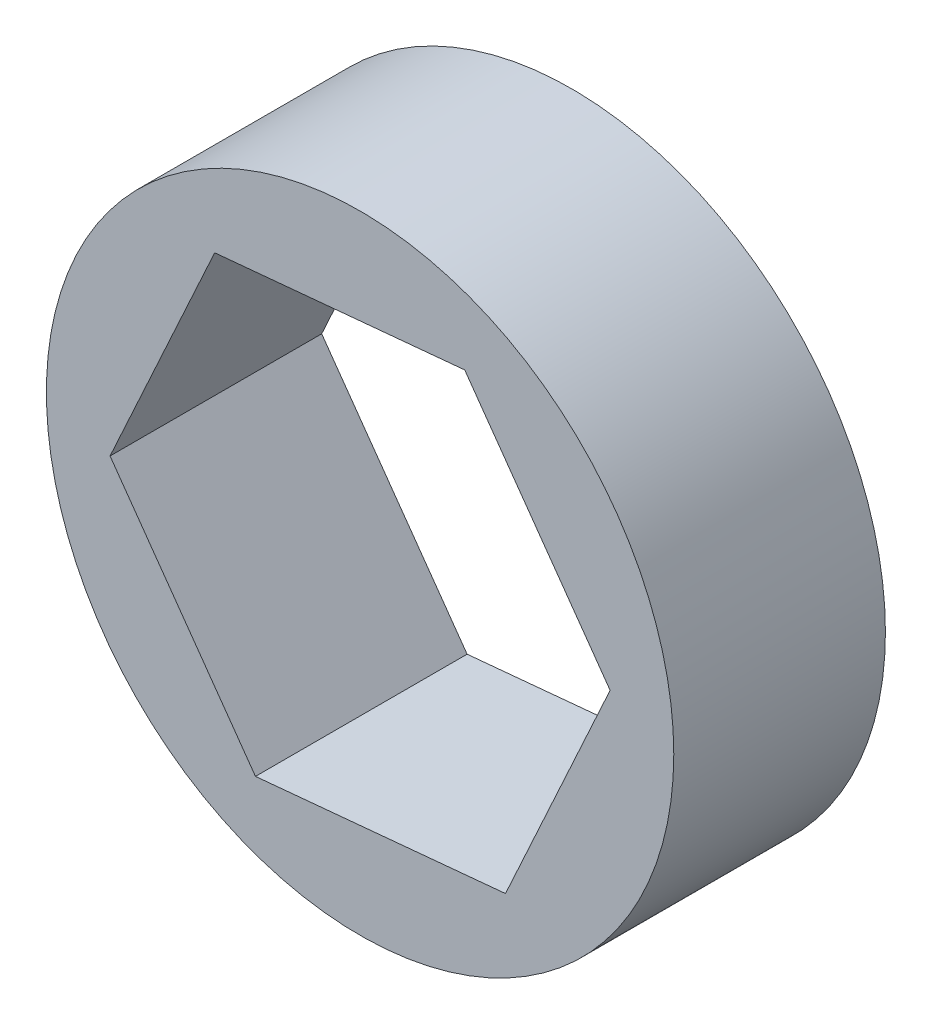
ISO-10303-21;
HEADER;
FILE_DESCRIPTION(('STEP AP214'),'2;1');
FILE_NAME('part.step','',(''),(''),'','','');
FILE_SCHEMA(('AUTOMOTIVE_DESIGN { 1 0 10303 214 1 1 1 1 }'));
ENDSEC;
DATA;
#1=APPLICATION_CONTEXT('core data for automotive mechanical design processes');
#2=APPLICATION_PROTOCOL_DEFINITION('international standard','automotive_design',2000,#1);
#3=PRODUCT_CONTEXT('',#1,'mechanical');
#4=PRODUCT('Part','Part','',(#3));
#5=PRODUCT_RELATED_PRODUCT_CATEGORY('part','',(#4));
#6=PRODUCT_DEFINITION_FORMATION('','',#4);
#7=PRODUCT_DEFINITION_CONTEXT('part definition',#1,'design');
#8=PRODUCT_DEFINITION('design','',#6,#7);
#9=PRODUCT_DEFINITION_SHAPE('','',#8);
#10=(LENGTH_UNIT() NAMED_UNIT(*) SI_UNIT(.MILLI.,.METRE.));
#11=(NAMED_UNIT(*) PLANE_ANGLE_UNIT() SI_UNIT($,.RADIAN.));
#12=(NAMED_UNIT(*) SI_UNIT($,.STERADIAN.) SOLID_ANGLE_UNIT());
#13=UNCERTAINTY_MEASURE_WITH_UNIT(LENGTH_MEASURE(1.E-05),#10,'distance_accuracy_value','');
#14=(GEOMETRIC_REPRESENTATION_CONTEXT(3) GLOBAL_UNCERTAINTY_ASSIGNED_CONTEXT((#13)) GLOBAL_UNIT_ASSIGNED_CONTEXT((#10,
#11,#12)) REPRESENTATION_CONTEXT('',''));
#15=CARTESIAN_POINT('',(0.,0.,0.));
#16=DIRECTION('',(0.,0.,1.));
#17=DIRECTION('',(1.,0.,0.));
#18=AXIS2_PLACEMENT_3D('',#15,#16,#17);
#19=CARTESIAN_POINT('',(0.,0.,6.4262));
#20=DIRECTION('',(0.,0.,1.));
#21=DIRECTION('',(1.,0.,0.));
#22=AXIS2_PLACEMENT_3D('',#19,#20,#21);
#23=PLANE('',#22);
#24=CARTESIAN_POINT('',(0.,0.,6.4262));
#25=DIRECTION('',(0.,0.,1.));
#26=DIRECTION('',(1.,0.,0.));
#27=AXIS2_PLACEMENT_3D('',#24,#25,#26);
#28=CIRCLE('',#27,9.525);
#29=CARTESIAN_POINT('',(9.525,0.,6.4262));
#30=VERTEX_POINT('',#29);
#31=EDGE_CURVE('E11',#30,#30,#28,.T.);
#32=ORIENTED_EDGE('',*,*,#31,.T.);
#33=EDGE_LOOP('',(#32));
#34=FACE_BOUND('',#33,.T.);
#35=DIRECTION('',(-0.416593831263026,-0.90909272340812,0.));
#36=VECTOR('',#35,1.);
#37=CARTESIAN_POINT('',(-4.41525056303659,6.2173936499902,6.4262));
#38=LINE('',#37,#36);
#39=CARTESIAN_POINT('',(-4.41525056303659,6.2173936499902,6.4262));
#40=VERTEX_POINT('',#39);
#41=CARTESIAN_POINT('',(-7.59204612773786,-0.715022326668139,6.4262));
#42=VERTEX_POINT('',#41);
#43=EDGE_CURVE('E94',#40,#42,#38,.T.);
#44=ORIENTED_EDGE('',*,*,#43,.F.);
#45=DIRECTION('',(-0.995594308498526,-0.0937655207703908,0.));
#46=VECTOR('',#45,1.);
#47=CARTESIAN_POINT('',(3.17679556470127,6.93241597665833,6.4262));
#48=LINE('',#47,#46);
#49=CARTESIAN_POINT('',(3.17679556470127,6.93241597665833,6.4262));
#50=VERTEX_POINT('',#49);
#51=EDGE_CURVE('E86',#50,#40,#48,.T.);
#52=ORIENTED_EDGE('',*,*,#51,.F.);
#53=DIRECTION('',(-0.579000477235499,0.815327202637729,0.));
#54=VECTOR('',#53,1.);
#55=CARTESIAN_POINT('',(7.59204612773786,0.715022326668137,6.4262));
#56=LINE('',#55,#54);
#57=CARTESIAN_POINT('',(7.59204612773786,0.715022326668137,6.4262));
#58=VERTEX_POINT('',#57);
#59=EDGE_CURVE('E114',#58,#50,#56,.T.);
#60=ORIENTED_EDGE('',*,*,#59,.F.);
#61=DIRECTION('',(0.416593831263027,0.90909272340812,0.));
#62=VECTOR('',#61,1.);
#63=CARTESIAN_POINT('',(4.41525056303659,-6.2173936499902,6.4262));
#64=LINE('',#63,#62);
#65=CARTESIAN_POINT('',(4.41525056303659,-6.2173936499902,6.4262));
#66=VERTEX_POINT('',#65);
#67=EDGE_CURVE('E112',#66,#58,#64,.T.);
#68=ORIENTED_EDGE('',*,*,#67,.F.);
#69=DIRECTION('',(0.995594308498526,0.0937655207703907,0.));
#70=VECTOR('',#69,1.);
#71=CARTESIAN_POINT('',(-3.17679556470126,-6.93241597665833,6.4262));
#72=LINE('',#71,#70);
#73=CARTESIAN_POINT('',(-3.17679556470126,-6.93241597665833,6.4262));
#74=VERTEX_POINT('',#73);
#75=EDGE_CURVE('E108',#74,#66,#72,.T.);
#76=ORIENTED_EDGE('',*,*,#75,.F.);
#77=DIRECTION('',(0.579000477235499,-0.815327202637729,0.));
#78=VECTOR('',#77,1.);
#79=CARTESIAN_POINT('',(-7.59204612773786,-0.715022326668139,6.4262));
#80=LINE('',#79,#78);
#81=EDGE_CURVE('E106',#42,#74,#80,.T.);
#82=ORIENTED_EDGE('',*,*,#81,.F.);
#83=EDGE_LOOP('',(#44,#52,#60,#68,#76,#82));
#84=FACE_BOUND('',#83,.T.);
#85=ADVANCED_FACE('F33',(#34,#84),#23,.T.);
#86=CARTESIAN_POINT('',(0.,0.,0.));
#87=DIRECTION('',(0.,0.,1.));
#88=DIRECTION('',(1.,0.,0.));
#89=AXIS2_PLACEMENT_3D('',#86,#87,#88);
#90=PLANE('',#89);
#91=CARTESIAN_POINT('',(0.,0.,0.));
#92=DIRECTION('',(0.,0.,1.));
#93=DIRECTION('',(1.,0.,0.));
#94=AXIS2_PLACEMENT_3D('',#91,#92,#93);
#95=CIRCLE('',#94,9.525);
#96=CARTESIAN_POINT('',(9.525,0.,0.));
#97=VERTEX_POINT('',#96);
#98=EDGE_CURVE('E37',#97,#97,#95,.T.);
#99=ORIENTED_EDGE('',*,*,#98,.F.);
#100=EDGE_LOOP('',(#99));
#101=FACE_BOUND('',#100,.T.);
#102=DIRECTION('',(-0.995594308498526,-0.0937655207703908,0.));
#103=VECTOR('',#102,1.);
#104=CARTESIAN_POINT('',(3.17679556470127,6.93241597665833,0.));
#105=LINE('',#104,#103);
#106=CARTESIAN_POINT('',(3.17679556470127,6.93241597665833,0.));
#107=VERTEX_POINT('',#106);
#108=CARTESIAN_POINT('',(-4.41525056303659,6.2173936499902,0.));
#109=VERTEX_POINT('',#108);
#110=EDGE_CURVE('E56',#107,#109,#105,.T.);
#111=ORIENTED_EDGE('',*,*,#110,.T.);
#112=DIRECTION('',(-0.416593831263026,-0.90909272340812,0.));
#113=VECTOR('',#112,1.);
#114=CARTESIAN_POINT('',(-4.41525056303659,6.2173936499902,0.));
#115=LINE('',#114,#113);
#116=CARTESIAN_POINT('',(-7.59204612773786,-0.715022326668139,0.));
#117=VERTEX_POINT('',#116);
#118=EDGE_CURVE('E101',#109,#117,#115,.T.);
#119=ORIENTED_EDGE('',*,*,#118,.T.);
#120=DIRECTION('',(0.579000477235499,-0.815327202637729,0.));
#121=VECTOR('',#120,1.);
#122=CARTESIAN_POINT('',(-7.59204612773786,-0.715022326668139,0.));
#123=LINE('',#122,#121);
#124=CARTESIAN_POINT('',(-3.17679556470126,-6.93241597665833,0.));
#125=VERTEX_POINT('',#124);
#126=EDGE_CURVE('E118',#117,#125,#123,.T.);
#127=ORIENTED_EDGE('',*,*,#126,.T.);
#128=DIRECTION('',(0.995594308498526,0.0937655207703907,0.));
#129=VECTOR('',#128,1.);
#130=CARTESIAN_POINT('',(-3.17679556470126,-6.93241597665833,0.));
#131=LINE('',#130,#129);
#132=CARTESIAN_POINT('',(4.41525056303659,-6.2173936499902,0.));
#133=VERTEX_POINT('',#132);
#134=EDGE_CURVE('E121',#125,#133,#131,.T.);
#135=ORIENTED_EDGE('',*,*,#134,.T.);
#136=DIRECTION('',(0.416593831263027,0.90909272340812,0.));
#137=VECTOR('',#136,1.);
#138=CARTESIAN_POINT('',(4.41525056303659,-6.2173936499902,0.));
#139=LINE('',#138,#137);
#140=CARTESIAN_POINT('',(7.59204612773786,0.715022326668137,0.));
#141=VERTEX_POINT('',#140);
#142=EDGE_CURVE('E124',#133,#141,#139,.T.);
#143=ORIENTED_EDGE('',*,*,#142,.T.);
#144=DIRECTION('',(-0.579000477235499,0.815327202637729,0.));
#145=VECTOR('',#144,1.);
#146=CARTESIAN_POINT('',(7.59204612773786,0.715022326668137,0.));
#147=LINE('',#146,#145);
#148=EDGE_CURVE('E95',#141,#107,#147,.T.);
#149=ORIENTED_EDGE('',*,*,#148,.T.);
#150=EDGE_LOOP('',(#111,#119,#127,#135,#143,#149));
#151=FACE_BOUND('',#150,.T.);
#152=ADVANCED_FACE('F141',(#101,#151),#90,.F.);
#153=CARTESIAN_POINT('',(0.,0.,6.4262));
#154=DIRECTION('',(0.,0.,-1.));
#155=DIRECTION('',(-1.,0.,0.));
#156=AXIS2_PLACEMENT_3D('',#153,#154,#155);
#157=CYLINDRICAL_SURFACE('',#156,9.525);
#158=ORIENTED_EDGE('',*,*,#31,.F.);
#159=EDGE_LOOP('',(#158));
#160=FACE_BOUND('',#159,.T.);
#161=ORIENTED_EDGE('',*,*,#98,.T.);
#162=EDGE_LOOP('',(#161));
#163=FACE_BOUND('',#162,.T.);
#164=ADVANCED_FACE('F35',(#160,#163),#157,.T.);
#165=CARTESIAN_POINT('',(3.17679556470127,6.93241597665833,6.4262));
#166=DIRECTION('',(0.0937655207703908,-0.995594308498526,0.));
#167=DIRECTION('',(0.995594308498526,0.0937655207703908,0.));
#168=AXIS2_PLACEMENT_3D('',#165,#166,#167);
#169=PLANE('',#168);
#170=ORIENTED_EDGE('',*,*,#110,.F.);
#171=DIRECTION('',(0.,0.,-1.));
#172=VECTOR('',#171,1.);
#173=CARTESIAN_POINT('',(3.17679556470127,6.93241597665833,6.4262));
#174=LINE('',#173,#172);
#175=EDGE_CURVE('E90',#50,#107,#174,.T.);
#176=ORIENTED_EDGE('',*,*,#175,.F.);
#177=ORIENTED_EDGE('',*,*,#51,.T.);
#178=DIRECTION('',(0.,0.,-1.));
#179=VECTOR('',#178,1.);
#180=CARTESIAN_POINT('',(-4.41525056303659,6.2173936499902,6.4262));
#181=LINE('',#180,#179);
#182=EDGE_CURVE('E89',#40,#109,#181,.T.);
#183=ORIENTED_EDGE('',*,*,#182,.T.);
#184=EDGE_LOOP('',(#170,#176,#177,#183));
#185=FACE_BOUND('',#184,.T.);
#186=ADVANCED_FACE('F88',(#185),#169,.T.);
#187=CARTESIAN_POINT('',(-4.41525056303659,6.2173936499902,6.4262));
#188=DIRECTION('',(0.90909272340812,-0.416593831263026,0.));
#189=DIRECTION('',(0.416593831263026,0.90909272340812,0.));
#190=AXIS2_PLACEMENT_3D('',#187,#188,#189);
#191=PLANE('',#190);
#192=ORIENTED_EDGE('',*,*,#118,.F.);
#193=ORIENTED_EDGE('',*,*,#182,.F.);
#194=ORIENTED_EDGE('',*,*,#43,.T.);
#195=DIRECTION('',(0.,0.,-1.));
#196=VECTOR('',#195,1.);
#197=CARTESIAN_POINT('',(-7.59204612773786,-0.715022326668139,6.4262));
#198=LINE('',#197,#196);
#199=EDGE_CURVE('E102',#42,#117,#198,.T.);
#200=ORIENTED_EDGE('',*,*,#199,.T.);
#201=EDGE_LOOP('',(#192,#193,#194,#200));
#202=FACE_BOUND('',#201,.T.);
#203=ADVANCED_FACE('F98',(#202),#191,.T.);
#204=CARTESIAN_POINT('',(-7.59204612773786,-0.715022326668139,6.4262));
#205=DIRECTION('',(0.815327202637729,0.579000477235499,0.));
#206=DIRECTION('',(-0.579000477235499,0.815327202637729,0.));
#207=AXIS2_PLACEMENT_3D('',#204,#205,#206);
#208=PLANE('',#207);
#209=ORIENTED_EDGE('',*,*,#126,.F.);
#210=ORIENTED_EDGE('',*,*,#199,.F.);
#211=ORIENTED_EDGE('',*,*,#81,.T.);
#212=DIRECTION('',(0.,0.,-1.));
#213=VECTOR('',#212,1.);
#214=CARTESIAN_POINT('',(-3.17679556470126,-6.93241597665833,6.4262));
#215=LINE('',#214,#213);
#216=EDGE_CURVE('E133',#74,#125,#215,.T.);
#217=ORIENTED_EDGE('',*,*,#216,.T.);
#218=EDGE_LOOP('',(#209,#210,#211,#217));
#219=FACE_BOUND('',#218,.T.);
#220=ADVANCED_FACE('F137',(#219),#208,.T.);
#221=CARTESIAN_POINT('',(-3.17679556470126,-6.93241597665833,6.4262));
#222=DIRECTION('',(-0.0937655207703907,0.995594308498526,0.));
#223=DIRECTION('',(-0.995594308498526,-0.0937655207703907,0.));
#224=AXIS2_PLACEMENT_3D('',#221,#222,#223);
#225=PLANE('',#224);
#226=ORIENTED_EDGE('',*,*,#134,.F.);
#227=ORIENTED_EDGE('',*,*,#216,.F.);
#228=ORIENTED_EDGE('',*,*,#75,.T.);
#229=DIRECTION('',(0.,0.,-1.));
#230=VECTOR('',#229,1.);
#231=CARTESIAN_POINT('',(4.41525056303659,-6.2173936499902,6.4262));
#232=LINE('',#231,#230);
#233=EDGE_CURVE('E131',#66,#133,#232,.T.);
#234=ORIENTED_EDGE('',*,*,#233,.T.);
#235=EDGE_LOOP('',(#226,#227,#228,#234));
#236=FACE_BOUND('',#235,.T.);
#237=ADVANCED_FACE('F149',(#236),#225,.T.);
#238=CARTESIAN_POINT('',(4.41525056303659,-6.2173936499902,6.4262));
#239=DIRECTION('',(-0.90909272340812,0.416593831263027,0.));
#240=DIRECTION('',(-0.416593831263027,-0.90909272340812,0.));
#241=AXIS2_PLACEMENT_3D('',#238,#239,#240);
#242=PLANE('',#241);
#243=ORIENTED_EDGE('',*,*,#142,.F.);
#244=ORIENTED_EDGE('',*,*,#233,.F.);
#245=ORIENTED_EDGE('',*,*,#67,.T.);
#246=DIRECTION('',(0.,0.,-1.));
#247=VECTOR('',#246,1.);
#248=CARTESIAN_POINT('',(7.59204612773786,0.715022326668137,6.4262));
#249=LINE('',#248,#247);
#250=EDGE_CURVE('E48',#58,#141,#249,.T.);
#251=ORIENTED_EDGE('',*,*,#250,.T.);
#252=EDGE_LOOP('',(#243,#244,#245,#251));
#253=FACE_BOUND('',#252,.T.);
#254=ADVANCED_FACE('F147',(#253),#242,.T.);
#255=CARTESIAN_POINT('',(7.59204612773786,0.715022326668137,6.4262));
#256=DIRECTION('',(-0.815327202637729,-0.579000477235499,0.));
#257=DIRECTION('',(0.579000477235499,-0.815327202637729,0.));
#258=AXIS2_PLACEMENT_3D('',#255,#256,#257);
#259=PLANE('',#258);
#260=ORIENTED_EDGE('',*,*,#148,.F.);
#261=ORIENTED_EDGE('',*,*,#250,.F.);
#262=ORIENTED_EDGE('',*,*,#59,.T.);
#263=ORIENTED_EDGE('',*,*,#175,.T.);
#264=EDGE_LOOP('',(#260,#261,#262,#263));
#265=FACE_BOUND('',#264,.T.);
#266=ADVANCED_FACE('F143',(#265),#259,.T.);
#267=CLOSED_SHELL('',(#85,#152,#164,#186,#203,#220,#237,#254,#266));
#268=MANIFOLD_SOLID_BREP('B2',#267);
#269=ADVANCED_BREP_SHAPE_REPRESENTATION('',(#18,#268),#14);
#270=SHAPE_DEFINITION_REPRESENTATION(#9,#269);
ENDSEC;
END-ISO-10303-21;
